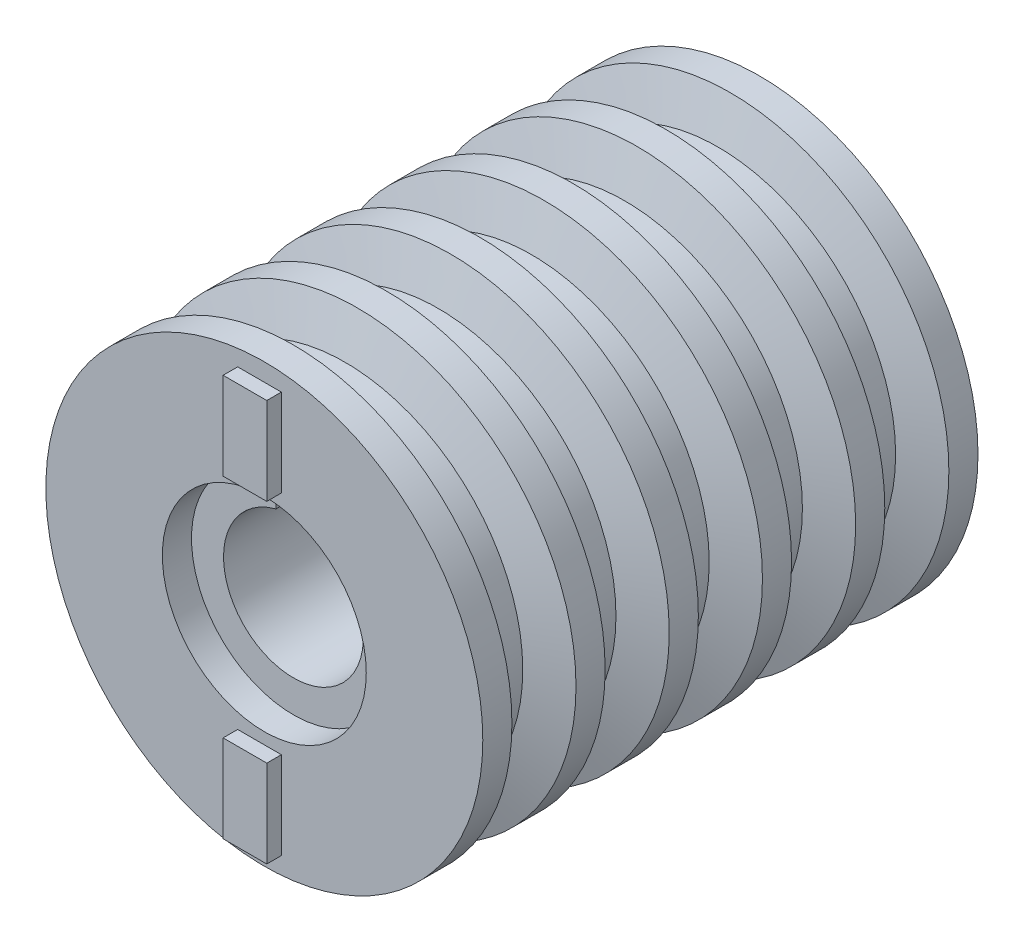
ISO-10303-21;
HEADER;
FILE_DESCRIPTION(('STEP AP214'),'2;1');
FILE_NAME('part.step','',(''),(''),'','','');
FILE_SCHEMA(('AUTOMOTIVE_DESIGN { 1 0 10303 214 1 1 1 1 }'));
ENDSEC;
DATA;
#1=APPLICATION_CONTEXT('core data for automotive mechanical design processes');
#2=APPLICATION_PROTOCOL_DEFINITION('international standard','automotive_design',2000,#1);
#3=PRODUCT_CONTEXT('',#1,'mechanical');
#4=PRODUCT('Part','Part','',(#3));
#5=PRODUCT_RELATED_PRODUCT_CATEGORY('part','',(#4));
#6=PRODUCT_DEFINITION_FORMATION('','',#4);
#7=PRODUCT_DEFINITION_CONTEXT('part definition',#1,'design');
#8=PRODUCT_DEFINITION('design','',#6,#7);
#9=PRODUCT_DEFINITION_SHAPE('','',#8);
#10=(LENGTH_UNIT() NAMED_UNIT(*) SI_UNIT(.MILLI.,.METRE.));
#11=(NAMED_UNIT(*) PLANE_ANGLE_UNIT() SI_UNIT($,.RADIAN.));
#12=(NAMED_UNIT(*) SI_UNIT($,.STERADIAN.) SOLID_ANGLE_UNIT());
#13=UNCERTAINTY_MEASURE_WITH_UNIT(LENGTH_MEASURE(1.E-05),#10,'distance_accuracy_value','');
#14=(GEOMETRIC_REPRESENTATION_CONTEXT(3) GLOBAL_UNCERTAINTY_ASSIGNED_CONTEXT((#13)) GLOBAL_UNIT_ASSIGNED_CONTEXT((#10,
#11,#12)) REPRESENTATION_CONTEXT('',''));
#15=CARTESIAN_POINT('',(0.,0.,0.));
#16=DIRECTION('',(0.,0.,1.));
#17=DIRECTION('',(1.,0.,0.));
#18=AXIS2_PLACEMENT_3D('',#15,#16,#17);
#19=CARTESIAN_POINT('',(0.,0.,85.));
#20=DIRECTION('',(0.,0.,1.));
#21=DIRECTION('',(1.,0.,0.));
#22=AXIS2_PLACEMENT_3D('',#19,#20,#21);
#23=PLANE('',#22);
#24=CARTESIAN_POINT('',(0.,0.,85.));
#25=DIRECTION('',(0.,0.,1.));
#26=DIRECTION('',(1.,0.,0.));
#27=AXIS2_PLACEMENT_3D('',#24,#25,#26);
#28=CIRCLE('',#27,35.);
#29=CARTESIAN_POINT('',(35.,0.,85.));
#30=VERTEX_POINT('',#29);
#31=EDGE_CURVE('E207',#30,#30,#28,.T.);
#32=ORIENTED_EDGE('',*,*,#31,.F.);
#33=EDGE_LOOP('',(#32));
#34=FACE_BOUND('',#33,.T.);
#35=CARTESIAN_POINT('',(0.,0.,85.));
#36=DIRECTION('',(0.,0.,1.));
#37=DIRECTION('',(1.,0.,0.));
#38=AXIS2_PLACEMENT_3D('',#35,#36,#37);
#39=CIRCLE('',#38,75.);
#40=CARTESIAN_POINT('',(75.,0.,85.));
#41=VERTEX_POINT('',#40);
#42=EDGE_CURVE('E287',#41,#41,#39,.T.);
#43=ORIENTED_EDGE('',*,*,#42,.T.);
#44=EDGE_LOOP('',(#43));
#45=FACE_BOUND('',#44,.T.);
#46=DIRECTION('',(0.,1.,0.));
#47=VECTOR('',#46,1.);
#48=CARTESIAN_POINT('',(5.85051895920107,-68.9005779312578,85.));
#49=LINE('',#48,#47);
#50=CARTESIAN_POINT('',(5.85051895920107,-68.9005779312578,85.));
#51=VERTEX_POINT('',#50);
#52=CARTESIAN_POINT('',(5.85051895920107,-38.9005779312578,85.));
#53=VERTEX_POINT('',#52);
#54=EDGE_CURVE('E186',#51,#53,#49,.T.);
#55=ORIENTED_EDGE('',*,*,#54,.F.);
#56=DIRECTION('',(1.,0.,0.));
#57=VECTOR('',#56,1.);
#58=CARTESIAN_POINT('',(-9.14948104079893,-68.9005779312578,85.));
#59=LINE('',#58,#57);
#60=CARTESIAN_POINT('',(-9.14948104079893,-68.9005779312578,85.));
#61=VERTEX_POINT('',#60);
#62=EDGE_CURVE('E188',#61,#51,#59,.T.);
#63=ORIENTED_EDGE('',*,*,#62,.F.);
#64=DIRECTION('',(0.,-1.,0.));
#65=VECTOR('',#64,1.);
#66=CARTESIAN_POINT('',(-9.14948104079893,-68.9005779312578,85.));
#67=LINE('',#66,#65);
#68=CARTESIAN_POINT('',(-9.14948104079893,-38.9005779312578,85.));
#69=VERTEX_POINT('',#68);
#70=EDGE_CURVE('E181',#69,#61,#67,.T.);
#71=ORIENTED_EDGE('',*,*,#70,.F.);
#72=DIRECTION('',(-1.,0.,0.));
#73=VECTOR('',#72,1.);
#74=CARTESIAN_POINT('',(-9.14948104079893,-38.9005779312578,85.));
#75=LINE('',#74,#73);
#76=EDGE_CURVE('E183',#53,#69,#75,.T.);
#77=ORIENTED_EDGE('',*,*,#76,.F.);
#78=EDGE_LOOP('',(#55,#63,#71,#77));
#79=FACE_BOUND('',#78,.T.);
#80=DIRECTION('',(1.,0.,0.));
#81=VECTOR('',#80,1.);
#82=CARTESIAN_POINT('',(-9.14948104079893,38.9005779312578,85.));
#83=LINE('',#82,#81);
#84=CARTESIAN_POINT('',(-9.14948104079893,38.9005779312578,85.));
#85=VERTEX_POINT('',#84);
#86=CARTESIAN_POINT('',(5.85051895920107,38.9005779312578,85.));
#87=VERTEX_POINT('',#86);
#88=EDGE_CURVE('E783',#85,#87,#83,.T.);
#89=ORIENTED_EDGE('',*,*,#88,.F.);
#90=DIRECTION('',(0.,-1.,0.));
#91=VECTOR('',#90,1.);
#92=CARTESIAN_POINT('',(-9.14948104079893,68.9005779312578,85.));
#93=LINE('',#92,#91);
#94=CARTESIAN_POINT('',(-9.14948104079893,68.9005779312578,85.));
#95=VERTEX_POINT('',#94);
#96=EDGE_CURVE('E161',#95,#85,#93,.T.);
#97=ORIENTED_EDGE('',*,*,#96,.F.);
#98=DIRECTION('',(-1.,0.,0.));
#99=VECTOR('',#98,1.);
#100=CARTESIAN_POINT('',(-9.14948104079893,68.9005779312578,85.));
#101=LINE('',#100,#99);
#102=CARTESIAN_POINT('',(5.85051895920107,68.9005779312578,85.));
#103=VERTEX_POINT('',#102);
#104=EDGE_CURVE('E157',#103,#95,#101,.T.);
#105=ORIENTED_EDGE('',*,*,#104,.F.);
#106=DIRECTION('',(0.,1.,0.));
#107=VECTOR('',#106,1.);
#108=CARTESIAN_POINT('',(5.85051895920107,68.9005779312578,85.));
#109=LINE('',#108,#107);
#110=EDGE_CURVE('E780',#87,#103,#109,.T.);
#111=ORIENTED_EDGE('',*,*,#110,.F.);
#112=EDGE_LOOP('',(#89,#97,#105,#111));
#113=FACE_BOUND('',#112,.T.);
#114=ADVANCED_FACE('F49',(#34,#45,#79,#113),#23,.T.);
#115=CARTESIAN_POINT('',(0.,0.,85.));
#116=DIRECTION('',(0.,0.,-1.));
#117=DIRECTION('',(-1.,0.,0.));
#118=AXIS2_PLACEMENT_3D('',#115,#116,#117);
#119=CYLINDRICAL_SURFACE('',#118,24.);
#120=DIRECTION('',(0.,0.,-1.));
#121=VECTOR('',#120,1.);
#122=CARTESIAN_POINT('',(6.,23.2379000772445,85.));
#123=LINE('',#122,#121);
#124=CARTESIAN_POINT('',(6.,23.2379000772445,-75.));
#125=VERTEX_POINT('',#124);
#126=CARTESIAN_POINT('',(6.,23.2379000772445,75.));
#127=VERTEX_POINT('',#126);
#128=EDGE_CURVE('E295',#125,#127,#123,.F.);
#129=ORIENTED_EDGE('',*,*,#128,.F.);
#130=CARTESIAN_POINT('',(0.,0.,-75.));
#131=DIRECTION('',(0.,0.,-1.));
#132=DIRECTION('',(-1.,0.,0.));
#133=AXIS2_PLACEMENT_3D('',#130,#131,#132);
#134=CIRCLE('',#133,24.);
#135=CARTESIAN_POINT('',(-6.,23.2379000772445,-75.));
#136=VERTEX_POINT('',#135);
#137=EDGE_CURVE('E204',#125,#136,#134,.T.);
#138=ORIENTED_EDGE('',*,*,#137,.T.);
#139=DIRECTION('',(0.,0.,-1.));
#140=VECTOR('',#139,1.);
#141=CARTESIAN_POINT('',(-6.,23.2379000772445,85.));
#142=LINE('',#141,#140);
#143=CARTESIAN_POINT('',(-6.,23.2379000772445,75.));
#144=VERTEX_POINT('',#143);
#145=EDGE_CURVE('E290',#144,#136,#142,.T.);
#146=ORIENTED_EDGE('',*,*,#145,.F.);
#147=CARTESIAN_POINT('',(0.,0.,75.));
#148=DIRECTION('',(0.,0.,1.));
#149=DIRECTION('',(1.,0.,0.));
#150=AXIS2_PLACEMENT_3D('',#147,#148,#149);
#151=CIRCLE('',#150,24.);
#152=EDGE_CURVE('E219',#144,#127,#151,.T.);
#153=ORIENTED_EDGE('',*,*,#152,.T.);
#154=EDGE_LOOP('',(#129,#138,#146,#153));
#155=FACE_BOUND('',#154,.T.);
#156=ADVANCED_FACE('F311',(#155),#119,.F.);
#157=CARTESIAN_POINT('',(6.,21.,-85.));
#158=DIRECTION('',(1.,0.,0.));
#159=DIRECTION('',(0.,0.,-1.));
#160=AXIS2_PLACEMENT_3D('',#157,#158,#159);
#161=PLANE('',#160);
#162=DIRECTION('',(0.,1.,0.));
#163=VECTOR('',#162,1.);
#164=CARTESIAN_POINT('',(6.,21.,-75.));
#165=LINE('',#164,#163);
#166=CARTESIAN_POINT('',(6.,27.,-75.));
#167=VERTEX_POINT('',#166);
#168=EDGE_CURVE('E202',#125,#167,#165,.T.);
#169=ORIENTED_EDGE('',*,*,#168,.F.);
#170=ORIENTED_EDGE('',*,*,#128,.T.);
#171=DIRECTION('',(0.,-1.,0.));
#172=VECTOR('',#171,1.);
#173=CARTESIAN_POINT('',(6.,21.,75.));
#174=LINE('',#173,#172);
#175=CARTESIAN_POINT('',(6.,27.,75.));
#176=VERTEX_POINT('',#175);
#177=EDGE_CURVE('E216',#176,#127,#174,.T.);
#178=ORIENTED_EDGE('',*,*,#177,.F.);
#179=DIRECTION('',(0.,0.,1.));
#180=VECTOR('',#179,1.);
#181=CARTESIAN_POINT('',(6.,27.,-85.));
#182=LINE('',#181,#180);
#183=EDGE_CURVE('E222',#167,#176,#182,.T.);
#184=ORIENTED_EDGE('',*,*,#183,.F.);
#185=EDGE_LOOP('',(#169,#170,#178,#184));
#186=FACE_BOUND('',#185,.T.);
#187=ADVANCED_FACE('F308',(#186),#161,.F.);
#188=CARTESIAN_POINT('',(-6.,21.,-85.));
#189=DIRECTION('',(-1.,0.,0.));
#190=DIRECTION('',(0.,0.,1.));
#191=AXIS2_PLACEMENT_3D('',#188,#189,#190);
#192=PLANE('',#191);
#193=DIRECTION('',(0.,-1.,0.));
#194=VECTOR('',#193,1.);
#195=CARTESIAN_POINT('',(-6.,21.,-75.));
#196=LINE('',#195,#194);
#197=CARTESIAN_POINT('',(-6.,27.,-75.));
#198=VERTEX_POINT('',#197);
#199=EDGE_CURVE('E199',#198,#136,#196,.T.);
#200=ORIENTED_EDGE('',*,*,#199,.F.);
#201=DIRECTION('',(0.,0.,1.));
#202=VECTOR('',#201,1.);
#203=CARTESIAN_POINT('',(-6.,27.,-85.));
#204=LINE('',#203,#202);
#205=CARTESIAN_POINT('',(-6.,27.,75.));
#206=VERTEX_POINT('',#205);
#207=EDGE_CURVE('E223',#198,#206,#204,.T.);
#208=ORIENTED_EDGE('',*,*,#207,.T.);
#209=DIRECTION('',(0.,1.,0.));
#210=VECTOR('',#209,1.);
#211=CARTESIAN_POINT('',(-6.,21.,75.));
#212=LINE('',#211,#210);
#213=EDGE_CURVE('E211',#144,#206,#212,.T.);
#214=ORIENTED_EDGE('',*,*,#213,.F.);
#215=ORIENTED_EDGE('',*,*,#145,.T.);
#216=EDGE_LOOP('',(#200,#208,#214,#215));
#217=FACE_BOUND('',#216,.T.);
#218=ADVANCED_FACE('F315',(#217),#192,.F.);
#219=CARTESIAN_POINT('',(-6.,27.,-85.));
#220=DIRECTION('',(0.,1.,0.));
#221=DIRECTION('',(0.,0.,1.));
#222=AXIS2_PLACEMENT_3D('',#219,#220,#221);
#223=PLANE('',#222);
#224=DIRECTION('',(-1.,0.,0.));
#225=VECTOR('',#224,1.);
#226=CARTESIAN_POINT('',(-6.,27.,-75.));
#227=LINE('',#226,#225);
#228=EDGE_CURVE('E11',#167,#198,#227,.T.);
#229=ORIENTED_EDGE('',*,*,#228,.F.);
#230=ORIENTED_EDGE('',*,*,#183,.T.);
#231=DIRECTION('',(1.,0.,0.));
#232=VECTOR('',#231,1.);
#233=CARTESIAN_POINT('',(-6.,27.,75.));
#234=LINE('',#233,#232);
#235=EDGE_CURVE('E57',#206,#176,#234,.T.);
#236=ORIENTED_EDGE('',*,*,#235,.F.);
#237=ORIENTED_EDGE('',*,*,#207,.F.);
#238=EDGE_LOOP('',(#229,#230,#236,#237));
#239=FACE_BOUND('',#238,.T.);
#240=ADVANCED_FACE('F317',(#239),#223,.F.);
#241=CARTESIAN_POINT('',(0.,0.,85.));
#242=DIRECTION('',(0.,0.,-1.));
#243=DIRECTION('',(-1.,0.,0.));
#244=AXIS2_PLACEMENT_3D('',#241,#242,#243);
#245=CYLINDRICAL_SURFACE('',#244,75.);
#246=CARTESIAN_POINT('',(0.,0.,-75.));
#247=DIRECTION('',(0.,0.,1.));
#248=DIRECTION('',(1.,0.,0.));
#249=AXIS2_PLACEMENT_3D('',#246,#247,#248);
#250=CIRCLE('',#249,75.);
#251=CARTESIAN_POINT('',(75.,0.,-75.));
#252=VERTEX_POINT('',#251);
#253=EDGE_CURVE('E237',#252,#252,#250,.T.);
#254=ORIENTED_EDGE('',*,*,#253,.F.);
#255=EDGE_LOOP('',(#254));
#256=FACE_BOUND('',#255,.T.);
#257=CARTESIAN_POINT('',(0.,0.,-85.));
#258=DIRECTION('',(0.,0.,1.));
#259=DIRECTION('',(1.,0.,0.));
#260=AXIS2_PLACEMENT_3D('',#257,#258,#259);
#261=CIRCLE('',#260,75.);
#262=CARTESIAN_POINT('',(75.,0.,-85.));
#263=VERTEX_POINT('',#262);
#264=EDGE_CURVE('E240',#263,#263,#261,.T.);
#265=ORIENTED_EDGE('',*,*,#264,.T.);
#266=EDGE_LOOP('',(#265));
#267=FACE_BOUND('',#266,.T.);
#268=ADVANCED_FACE('F339',(#256,#267),#245,.T.);
#269=CARTESIAN_POINT('',(0.,0.,75.));
#270=DIRECTION('',(0.,0.,1.));
#271=DIRECTION('',(1.,0.,0.));
#272=AXIS2_PLACEMENT_3D('',#269,#270,#271);
#273=CIRCLE('',#272,75.);
#274=CARTESIAN_POINT('',(75.,0.,75.));
#275=VERTEX_POINT('',#274);
#276=EDGE_CURVE('E245',#275,#275,#273,.T.);
#277=ORIENTED_EDGE('',*,*,#276,.T.);
#278=EDGE_LOOP('',(#277));
#279=FACE_BOUND('',#278,.T.);
#280=ORIENTED_EDGE('',*,*,#42,.F.);
#281=EDGE_LOOP('',(#280));
#282=FACE_BOUND('',#281,.T.);
#283=ADVANCED_FACE('F336',(#279,#282),#245,.T.);
#284=CARTESIAN_POINT('',(0.,0.,-85.));
#285=DIRECTION('',(0.,0.,1.));
#286=DIRECTION('',(1.,0.,0.));
#287=AXIS2_PLACEMENT_3D('',#284,#285,#286);
#288=PLANE('',#287);
#289=CARTESIAN_POINT('',(0.,0.,-85.));
#290=DIRECTION('',(0.,0.,1.));
#291=DIRECTION('',(1.,0.,0.));
#292=AXIS2_PLACEMENT_3D('',#289,#290,#291);
#293=CIRCLE('',#292,35.);
#294=CARTESIAN_POINT('',(35.,0.,-85.));
#295=VERTEX_POINT('',#294);
#296=EDGE_CURVE('E163',#295,#295,#293,.T.);
#297=ORIENTED_EDGE('',*,*,#296,.T.);
#298=EDGE_LOOP('',(#297));
#299=FACE_BOUND('',#298,.T.);
#300=ORIENTED_EDGE('',*,*,#264,.F.);
#301=EDGE_LOOP('',(#300));
#302=FACE_BOUND('',#301,.T.);
#303=ADVANCED_FACE('F332',(#299,#302),#288,.F.);
#304=CARTESIAN_POINT('',(0.,0.,70.7197704595787));
#305=DIRECTION('',(0.,0.,1.));
#306=DIRECTION('',(1.,0.,0.));
#307=AXIS2_PLACEMENT_3D('',#304,#305,#306);
#308=CONICAL_SURFACE('',#307,61.,1.27409035395586);
#309=ORIENTED_EDGE('',*,*,#276,.F.);
#310=EDGE_LOOP('',(#309));
#311=FACE_BOUND('',#310,.T.);
#312=CARTESIAN_POINT('',(0.,0.,70.7197704595787));
#313=DIRECTION('',(0.,0.,1.));
#314=DIRECTION('',(1.,0.,0.));
#315=AXIS2_PLACEMENT_3D('',#312,#313,#314);
#316=CIRCLE('',#315,61.);
#317=CARTESIAN_POINT('',(61.,0.,70.7197704595787));
#318=VERTEX_POINT('',#317);
#319=EDGE_CURVE('E225',#318,#318,#316,.T.);
#320=ORIENTED_EDGE('',*,*,#319,.T.);
#321=EDGE_LOOP('',(#320));
#322=FACE_BOUND('',#321,.T.);
#323=ADVANCED_FACE('F335',(#311,#322),#308,.T.);
#324=CARTESIAN_POINT('',(0.,0.,53.));
#325=DIRECTION('',(0.,0.,-1.));
#326=DIRECTION('',(-1.,0.,0.));
#327=AXIS2_PLACEMENT_3D('',#324,#325,#326);
#328=CONICAL_SURFACE('',#327,75.,1.27409035395586);
#329=CARTESIAN_POINT('',(0.,0.,57.2802295404213));
#330=DIRECTION('',(0.,0.,1.));
#331=DIRECTION('',(1.,0.,0.));
#332=AXIS2_PLACEMENT_3D('',#329,#330,#331);
#333=CIRCLE('',#332,61.);
#334=CARTESIAN_POINT('',(61.,0.,57.2802295404213));
#335=VERTEX_POINT('',#334);
#336=EDGE_CURVE('E257',#335,#335,#333,.T.);
#337=ORIENTED_EDGE('',*,*,#336,.F.);
#338=EDGE_LOOP('',(#337));
#339=FACE_BOUND('',#338,.T.);
#340=CARTESIAN_POINT('',(0.,0.,53.));
#341=DIRECTION('',(0.,0.,1.));
#342=DIRECTION('',(1.,0.,0.));
#343=AXIS2_PLACEMENT_3D('',#340,#341,#342);
#344=CIRCLE('',#343,75.);
#345=CARTESIAN_POINT('',(75.,0.,53.));
#346=VERTEX_POINT('',#345);
#347=EDGE_CURVE('E260',#346,#346,#344,.T.);
#348=ORIENTED_EDGE('',*,*,#347,.T.);
#349=EDGE_LOOP('',(#348));
#350=FACE_BOUND('',#349,.T.);
#351=ADVANCED_FACE('F392',(#339,#350),#328,.T.);
#352=CARTESIAN_POINT('',(0.,0.,0.));
#353=DIRECTION('',(0.,0.,1.));
#354=DIRECTION('',(1.,0.,0.));
#355=AXIS2_PLACEMENT_3D('',#352,#353,#354);
#356=CYLINDRICAL_SURFACE('',#355,61.);
#357=ORIENTED_EDGE('',*,*,#319,.F.);
#358=EDGE_LOOP('',(#357));
#359=FACE_BOUND('',#358,.T.);
#360=ORIENTED_EDGE('',*,*,#336,.T.);
#361=EDGE_LOOP('',(#360));
#362=FACE_BOUND('',#361,.T.);
#363=ADVANCED_FACE('F396',(#359,#362),#356,.T.);
#364=CARTESIAN_POINT('',(0.,0.,-75.));
#365=DIRECTION('',(0.,0.,-1.));
#366=DIRECTION('',(-1.,0.,0.));
#367=AXIS2_PLACEMENT_3D('',#364,#365,#366);
#368=CONICAL_SURFACE('',#367,75.,1.27409035395586);
#369=CARTESIAN_POINT('',(0.,0.,-70.7197704595787));
#370=DIRECTION('',(0.,0.,1.));
#371=DIRECTION('',(1.,0.,0.));
#372=AXIS2_PLACEMENT_3D('',#369,#370,#371);
#373=CIRCLE('',#372,61.);
#374=CARTESIAN_POINT('',(61.,0.,-70.7197704595787));
#375=VERTEX_POINT('',#374);
#376=EDGE_CURVE('E234',#375,#375,#373,.T.);
#377=ORIENTED_EDGE('',*,*,#376,.F.);
#378=EDGE_LOOP('',(#377));
#379=FACE_BOUND('',#378,.T.);
#380=ORIENTED_EDGE('',*,*,#253,.T.);
#381=EDGE_LOOP('',(#380));
#382=FACE_BOUND('',#381,.T.);
#383=ADVANCED_FACE('F400',(#379,#382),#368,.T.);
#384=CARTESIAN_POINT('',(0.,0.,0.));
#385=DIRECTION('',(0.,0.,1.));
#386=DIRECTION('',(1.,0.,0.));
#387=AXIS2_PLACEMENT_3D('',#384,#385,#386);
#388=CYLINDRICAL_SURFACE('',#387,61.);
#389=CARTESIAN_POINT('',(0.,0.,-57.2802295404213));
#390=DIRECTION('',(0.,0.,1.));
#391=DIRECTION('',(1.,0.,0.));
#392=AXIS2_PLACEMENT_3D('',#389,#390,#391);
#393=CIRCLE('',#392,61.);
#394=CARTESIAN_POINT('',(61.,0.,-57.2802295404213));
#395=VERTEX_POINT('',#394);
#396=EDGE_CURVE('E230',#395,#395,#393,.T.);
#397=ORIENTED_EDGE('',*,*,#396,.F.);
#398=EDGE_LOOP('',(#397));
#399=FACE_BOUND('',#398,.T.);
#400=ORIENTED_EDGE('',*,*,#376,.T.);
#401=EDGE_LOOP('',(#400));
#402=FACE_BOUND('',#401,.T.);
#403=ADVANCED_FACE('F416',(#399,#402),#388,.T.);
#404=CARTESIAN_POINT('',(0.,0.,-57.2802295404213));
#405=DIRECTION('',(0.,0.,1.));
#406=DIRECTION('',(1.,0.,0.));
#407=AXIS2_PLACEMENT_3D('',#404,#405,#406);
#408=CONICAL_SURFACE('',#407,61.,1.27409035395586);
#409=CARTESIAN_POINT('',(0.,0.,-53.));
#410=DIRECTION('',(0.,0.,1.));
#411=DIRECTION('',(1.,0.,0.));
#412=AXIS2_PLACEMENT_3D('',#409,#410,#411);
#413=CIRCLE('',#412,75.);
#414=CARTESIAN_POINT('',(75.,0.,-53.));
#415=VERTEX_POINT('',#414);
#416=EDGE_CURVE('E227',#415,#415,#413,.T.);
#417=ORIENTED_EDGE('',*,*,#416,.F.);
#418=EDGE_LOOP('',(#417));
#419=FACE_BOUND('',#418,.T.);
#420=ORIENTED_EDGE('',*,*,#396,.T.);
#421=EDGE_LOOP('',(#420));
#422=FACE_BOUND('',#421,.T.);
#423=ADVANCED_FACE('F420',(#419,#422),#408,.T.);
#424=ORIENTED_EDGE('',*,*,#416,.T.);
#425=EDGE_LOOP('',(#424));
#426=FACE_BOUND('',#425,.T.);
#427=CARTESIAN_POINT('',(0.,0.,-43.));
#428=DIRECTION('',(0.,0.,1.));
#429=DIRECTION('',(1.,0.,0.));
#430=AXIS2_PLACEMENT_3D('',#427,#428,#429);
#431=CIRCLE('',#430,75.);
#432=CARTESIAN_POINT('',(75.,0.,-43.));
#433=VERTEX_POINT('',#432);
#434=EDGE_CURVE('E231',#433,#433,#431,.T.);
#435=ORIENTED_EDGE('',*,*,#434,.F.);
#436=EDGE_LOOP('',(#435));
#437=FACE_BOUND('',#436,.T.);
#438=ADVANCED_FACE('F352',(#426,#437),#245,.T.);
#439=ORIENTED_EDGE('',*,*,#347,.F.);
#440=EDGE_LOOP('',(#439));
#441=FACE_BOUND('',#440,.T.);
#442=CARTESIAN_POINT('',(0.,0.,43.));
#443=DIRECTION('',(0.,0.,1.));
#444=DIRECTION('',(1.,0.,0.));
#445=AXIS2_PLACEMENT_3D('',#442,#443,#444);
#446=CIRCLE('',#445,75.);
#447=CARTESIAN_POINT('',(75.,0.,43.));
#448=VERTEX_POINT('',#447);
#449=EDGE_CURVE('E282',#448,#448,#446,.T.);
#450=ORIENTED_EDGE('',*,*,#449,.T.);
#451=EDGE_LOOP('',(#450));
#452=FACE_BOUND('',#451,.T.);
#453=ADVANCED_FACE('F51',(#441,#452),#245,.T.);
#454=CARTESIAN_POINT('',(0.,0.,21.));
#455=DIRECTION('',(0.,0.,-1.));
#456=DIRECTION('',(-1.,0.,0.));
#457=AXIS2_PLACEMENT_3D('',#454,#455,#456);
#458=CONICAL_SURFACE('',#457,75.,1.27409035395586);
#459=CARTESIAN_POINT('',(0.,0.,25.2802295404213));
#460=DIRECTION('',(0.,0.,1.));
#461=DIRECTION('',(1.,0.,0.));
#462=AXIS2_PLACEMENT_3D('',#459,#460,#461);
#463=CIRCLE('',#462,61.);
#464=CARTESIAN_POINT('',(61.,0.,25.2802295404213));
#465=VERTEX_POINT('',#464);
#466=EDGE_CURVE('E254',#465,#465,#463,.T.);
#467=ORIENTED_EDGE('',*,*,#466,.F.);
#468=EDGE_LOOP('',(#467));
#469=FACE_BOUND('',#468,.T.);
#470=CARTESIAN_POINT('',(0.,0.,21.));
#471=DIRECTION('',(0.,0.,1.));
#472=DIRECTION('',(1.,0.,0.));
#473=AXIS2_PLACEMENT_3D('',#470,#471,#472);
#474=CIRCLE('',#473,75.);
#475=CARTESIAN_POINT('',(75.,0.,21.));
#476=VERTEX_POINT('',#475);
#477=EDGE_CURVE('E269',#476,#476,#474,.T.);
#478=ORIENTED_EDGE('',*,*,#477,.T.);
#479=EDGE_LOOP('',(#478));
#480=FACE_BOUND('',#479,.T.);
#481=ADVANCED_FACE('F351',(#469,#480),#458,.T.);
#482=CARTESIAN_POINT('',(0.,0.,38.7197704595787));
#483=DIRECTION('',(0.,0.,1.));
#484=DIRECTION('',(1.,0.,0.));
#485=AXIS2_PLACEMENT_3D('',#482,#483,#484);
#486=CONICAL_SURFACE('',#485,61.,1.27409035395586);
#487=ORIENTED_EDGE('',*,*,#449,.F.);
#488=EDGE_LOOP('',(#487));
#489=FACE_BOUND('',#488,.T.);
#490=CARTESIAN_POINT('',(0.,0.,38.7197704595787));
#491=DIRECTION('',(0.,0.,1.));
#492=DIRECTION('',(1.,0.,0.));
#493=AXIS2_PLACEMENT_3D('',#490,#491,#492);
#494=CIRCLE('',#493,61.);
#495=CARTESIAN_POINT('',(61.,0.,38.7197704595787));
#496=VERTEX_POINT('',#495);
#497=EDGE_CURVE('E279',#496,#496,#494,.T.);
#498=ORIENTED_EDGE('',*,*,#497,.T.);
#499=EDGE_LOOP('',(#498));
#500=FACE_BOUND('',#499,.T.);
#501=ADVANCED_FACE('F367',(#489,#500),#486,.T.);
#502=CARTESIAN_POINT('',(0.,0.,0.));
#503=DIRECTION('',(0.,0.,1.));
#504=DIRECTION('',(1.,0.,0.));
#505=AXIS2_PLACEMENT_3D('',#502,#503,#504);
#506=CYLINDRICAL_SURFACE('',#505,61.);
#507=ORIENTED_EDGE('',*,*,#497,.F.);
#508=EDGE_LOOP('',(#507));
#509=FACE_BOUND('',#508,.T.);
#510=ORIENTED_EDGE('',*,*,#466,.T.);
#511=EDGE_LOOP('',(#510));
#512=FACE_BOUND('',#511,.T.);
#513=ADVANCED_FACE('F371',(#509,#512),#506,.T.);
#514=CARTESIAN_POINT('',(0.,0.,11.));
#515=DIRECTION('',(0.,0.,1.));
#516=DIRECTION('',(1.,0.,0.));
#517=AXIS2_PLACEMENT_3D('',#514,#515,#516);
#518=CIRCLE('',#517,75.);
#519=CARTESIAN_POINT('',(75.,0.,11.));
#520=VERTEX_POINT('',#519);
#521=EDGE_CURVE('E241',#520,#520,#518,.T.);
#522=ORIENTED_EDGE('',*,*,#521,.T.);
#523=EDGE_LOOP('',(#522));
#524=FACE_BOUND('',#523,.T.);
#525=ORIENTED_EDGE('',*,*,#477,.F.);
#526=EDGE_LOOP('',(#525));
#527=FACE_BOUND('',#526,.T.);
#528=ADVANCED_FACE('F375',(#524,#527),#245,.T.);
#529=CARTESIAN_POINT('',(0.,0.,-11.));
#530=DIRECTION('',(0.,0.,-1.));
#531=DIRECTION('',(-1.,0.,0.));
#532=AXIS2_PLACEMENT_3D('',#529,#530,#531);
#533=CONICAL_SURFACE('',#532,75.,1.27409035395586);
#534=CARTESIAN_POINT('',(0.,0.,-6.7197704595787));
#535=DIRECTION('',(0.,0.,1.));
#536=DIRECTION('',(1.,0.,0.));
#537=AXIS2_PLACEMENT_3D('',#534,#535,#536);
#538=CIRCLE('',#537,61.);
#539=CARTESIAN_POINT('',(61.,0.,-6.7197704595787));
#540=VERTEX_POINT('',#539);
#541=EDGE_CURVE('E248',#540,#540,#538,.T.);
#542=ORIENTED_EDGE('',*,*,#541,.F.);
#543=EDGE_LOOP('',(#542));
#544=FACE_BOUND('',#543,.T.);
#545=CARTESIAN_POINT('',(0.,0.,-11.));
#546=DIRECTION('',(0.,0.,1.));
#547=DIRECTION('',(1.,0.,0.));
#548=AXIS2_PLACEMENT_3D('',#545,#546,#547);
#549=CIRCLE('',#548,75.);
#550=CARTESIAN_POINT('',(75.,0.,-11.));
#551=VERTEX_POINT('',#550);
#552=EDGE_CURVE('E251',#551,#551,#549,.T.);
#553=ORIENTED_EDGE('',*,*,#552,.T.);
#554=EDGE_LOOP('',(#553));
#555=FACE_BOUND('',#554,.T.);
#556=ADVANCED_FACE('F402',(#544,#555),#533,.T.);
#557=CARTESIAN_POINT('',(0.,0.,0.));
#558=DIRECTION('',(0.,0.,1.));
#559=DIRECTION('',(1.,0.,0.));
#560=AXIS2_PLACEMENT_3D('',#557,#558,#559);
#561=CYLINDRICAL_SURFACE('',#560,61.);
#562=CARTESIAN_POINT('',(0.,0.,6.71977045957869));
#563=DIRECTION('',(0.,0.,1.));
#564=DIRECTION('',(1.,0.,0.));
#565=AXIS2_PLACEMENT_3D('',#562,#563,#564);
#566=CIRCLE('',#565,61.);
#567=CARTESIAN_POINT('',(61.,0.,6.71977045957869));
#568=VERTEX_POINT('',#567);
#569=EDGE_CURVE('E244',#568,#568,#566,.T.);
#570=ORIENTED_EDGE('',*,*,#569,.F.);
#571=EDGE_LOOP('',(#570));
#572=FACE_BOUND('',#571,.T.);
#573=ORIENTED_EDGE('',*,*,#541,.T.);
#574=EDGE_LOOP('',(#573));
#575=FACE_BOUND('',#574,.T.);
#576=ADVANCED_FACE('F405',(#572,#575),#561,.T.);
#577=CARTESIAN_POINT('',(0.,0.,6.71977045957869));
#578=DIRECTION('',(0.,0.,1.));
#579=DIRECTION('',(1.,0.,0.));
#580=AXIS2_PLACEMENT_3D('',#577,#578,#579);
#581=CONICAL_SURFACE('',#580,61.,1.27409035395586);
#582=ORIENTED_EDGE('',*,*,#521,.F.);
#583=EDGE_LOOP('',(#582));
#584=FACE_BOUND('',#583,.T.);
#585=ORIENTED_EDGE('',*,*,#569,.T.);
#586=EDGE_LOOP('',(#585));
#587=FACE_BOUND('',#586,.T.);
#588=ADVANCED_FACE('F409',(#584,#587),#581,.T.);
#589=ORIENTED_EDGE('',*,*,#552,.F.);
#590=EDGE_LOOP('',(#589));
#591=FACE_BOUND('',#590,.T.);
#592=CARTESIAN_POINT('',(0.,0.,-21.));
#593=DIRECTION('',(0.,0.,1.));
#594=DIRECTION('',(1.,0.,0.));
#595=AXIS2_PLACEMENT_3D('',#592,#593,#594);
#596=CIRCLE('',#595,75.);
#597=CARTESIAN_POINT('',(75.,0.,-21.));
#598=VERTEX_POINT('',#597);
#599=EDGE_CURVE('E272',#598,#598,#596,.T.);
#600=ORIENTED_EDGE('',*,*,#599,.T.);
#601=EDGE_LOOP('',(#600));
#602=FACE_BOUND('',#601,.T.);
#603=ADVANCED_FACE('F346',(#591,#602),#245,.T.);
#604=CARTESIAN_POINT('',(0.,0.,-43.));
#605=DIRECTION('',(0.,0.,-1.));
#606=DIRECTION('',(-1.,0.,0.));
#607=AXIS2_PLACEMENT_3D('',#604,#605,#606);
#608=CONICAL_SURFACE('',#607,75.,1.27409035395586);
#609=CARTESIAN_POINT('',(0.,0.,-38.7197704595787));
#610=DIRECTION('',(0.,0.,1.));
#611=DIRECTION('',(1.,0.,0.));
#612=AXIS2_PLACEMENT_3D('',#609,#610,#611);
#613=CIRCLE('',#612,61.);
#614=CARTESIAN_POINT('',(61.,0.,-38.7197704595787));
#615=VERTEX_POINT('',#614);
#616=EDGE_CURVE('E265',#615,#615,#613,.T.);
#617=ORIENTED_EDGE('',*,*,#616,.F.);
#618=EDGE_LOOP('',(#617));
#619=FACE_BOUND('',#618,.T.);
#620=ORIENTED_EDGE('',*,*,#434,.T.);
#621=EDGE_LOOP('',(#620));
#622=FACE_BOUND('',#621,.T.);
#623=ADVANCED_FACE('F377',(#619,#622),#608,.T.);
#624=CARTESIAN_POINT('',(0.,0.,-25.2802295404213));
#625=DIRECTION('',(0.,0.,1.));
#626=DIRECTION('',(1.,0.,0.));
#627=AXIS2_PLACEMENT_3D('',#624,#625,#626);
#628=CONICAL_SURFACE('',#627,61.,1.27409035395586);
#629=ORIENTED_EDGE('',*,*,#599,.F.);
#630=EDGE_LOOP('',(#629));
#631=FACE_BOUND('',#630,.T.);
#632=CARTESIAN_POINT('',(0.,0.,-25.2802295404213));
#633=DIRECTION('',(0.,0.,1.));
#634=DIRECTION('',(1.,0.,0.));
#635=AXIS2_PLACEMENT_3D('',#632,#633,#634);
#636=CIRCLE('',#635,61.);
#637=CARTESIAN_POINT('',(61.,0.,-25.2802295404213));
#638=VERTEX_POINT('',#637);
#639=EDGE_CURVE('E268',#638,#638,#636,.T.);
#640=ORIENTED_EDGE('',*,*,#639,.T.);
#641=EDGE_LOOP('',(#640));
#642=FACE_BOUND('',#641,.T.);
#643=ADVANCED_FACE('F380',(#631,#642),#628,.T.);
#644=CARTESIAN_POINT('',(0.,0.,0.));
#645=DIRECTION('',(0.,0.,1.));
#646=DIRECTION('',(1.,0.,0.));
#647=AXIS2_PLACEMENT_3D('',#644,#645,#646);
#648=CYLINDRICAL_SURFACE('',#647,61.);
#649=ORIENTED_EDGE('',*,*,#639,.F.);
#650=EDGE_LOOP('',(#649));
#651=FACE_BOUND('',#650,.T.);
#652=ORIENTED_EDGE('',*,*,#616,.T.);
#653=EDGE_LOOP('',(#652));
#654=FACE_BOUND('',#653,.T.);
#655=ADVANCED_FACE('F384',(#651,#654),#648,.T.);
#656=CARTESIAN_POINT('',(0.,0.,75.));
#657=DIRECTION('',(0.,0.,1.));
#658=DIRECTION('',(1.,0.,0.));
#659=AXIS2_PLACEMENT_3D('',#656,#657,#658);
#660=CYLINDRICAL_SURFACE('',#659,35.);
#661=CARTESIAN_POINT('',(0.,0.,75.));
#662=DIRECTION('',(0.,0.,1.));
#663=DIRECTION('',(1.,0.,0.));
#664=AXIS2_PLACEMENT_3D('',#661,#662,#663);
#665=CIRCLE('',#664,35.);
#666=CARTESIAN_POINT('',(35.,0.,75.));
#667=VERTEX_POINT('',#666);
#668=EDGE_CURVE('E208',#667,#667,#665,.T.);
#669=ORIENTED_EDGE('',*,*,#668,.F.);
#670=EDGE_LOOP('',(#669));
#671=FACE_BOUND('',#670,.T.);
#672=ORIENTED_EDGE('',*,*,#31,.T.);
#673=EDGE_LOOP('',(#672));
#674=FACE_BOUND('',#673,.T.);
#675=ADVANCED_FACE('F388',(#671,#674),#660,.F.);
#676=CARTESIAN_POINT('',(0.,0.,75.));
#677=DIRECTION('',(0.,0.,1.));
#678=DIRECTION('',(1.,0.,0.));
#679=AXIS2_PLACEMENT_3D('',#676,#677,#678);
#680=PLANE('',#679);
#681=ORIENTED_EDGE('',*,*,#213,.T.);
#682=ORIENTED_EDGE('',*,*,#235,.T.);
#683=ORIENTED_EDGE('',*,*,#177,.T.);
#684=ORIENTED_EDGE('',*,*,#152,.F.);
#685=EDGE_LOOP('',(#681,#682,#683,#684));
#686=FACE_BOUND('',#685,.T.);
#687=ORIENTED_EDGE('',*,*,#668,.T.);
#688=EDGE_LOOP('',(#687));
#689=FACE_BOUND('',#688,.T.);
#690=ADVANCED_FACE('F300',(#686,#689),#680,.T.);
#691=CARTESIAN_POINT('',(0.,0.,-75.));
#692=DIRECTION('',(0.,0.,-1.));
#693=DIRECTION('',(1.,0.,0.));
#694=AXIS2_PLACEMENT_3D('',#691,#692,#693);
#695=PLANE('',#694);
#696=ORIENTED_EDGE('',*,*,#168,.T.);
#697=ORIENTED_EDGE('',*,*,#228,.T.);
#698=ORIENTED_EDGE('',*,*,#199,.T.);
#699=ORIENTED_EDGE('',*,*,#137,.F.);
#700=EDGE_LOOP('',(#696,#697,#698,#699));
#701=FACE_BOUND('',#700,.T.);
#702=CARTESIAN_POINT('',(0.,0.,-75.));
#703=DIRECTION('',(0.,0.,1.));
#704=DIRECTION('',(1.,0.,0.));
#705=AXIS2_PLACEMENT_3D('',#702,#703,#704);
#706=CIRCLE('',#705,35.);
#707=CARTESIAN_POINT('',(35.,0.,-75.));
#708=VERTEX_POINT('',#707);
#709=EDGE_CURVE('E166',#708,#708,#706,.T.);
#710=ORIENTED_EDGE('',*,*,#709,.F.);
#711=EDGE_LOOP('',(#710));
#712=FACE_BOUND('',#711,.T.);
#713=ADVANCED_FACE('F319',(#701,#712),#695,.T.);
#714=CARTESIAN_POINT('',(0.,0.,-75.));
#715=DIRECTION('',(0.,0.,-1.));
#716=DIRECTION('',(-1.,0.,0.));
#717=AXIS2_PLACEMENT_3D('',#714,#715,#716);
#718=CYLINDRICAL_SURFACE('',#717,35.);
#719=ORIENTED_EDGE('',*,*,#709,.T.);
#720=EDGE_LOOP('',(#719));
#721=FACE_BOUND('',#720,.T.);
#722=ORIENTED_EDGE('',*,*,#296,.F.);
#723=EDGE_LOOP('',(#722));
#724=FACE_BOUND('',#723,.T.);
#725=ADVANCED_FACE('F322',(#721,#724),#718,.F.);
#726=CARTESIAN_POINT('',(-9.14948104079893,-68.9005779312578,90.));
#727=DIRECTION('',(0.,1.,0.));
#728=DIRECTION('',(0.,0.,1.));
#729=AXIS2_PLACEMENT_3D('',#726,#727,#728);
#730=PLANE('',#729);
#731=ORIENTED_EDGE('',*,*,#62,.T.);
#732=DIRECTION('',(0.,0.,-1.));
#733=VECTOR('',#732,1.);
#734=CARTESIAN_POINT('',(5.85051895920107,-68.9005779312578,90.));
#735=LINE('',#734,#733);
#736=CARTESIAN_POINT('',(5.85051895920107,-68.9005779312578,90.));
#737=VERTEX_POINT('',#736);
#738=EDGE_CURVE('E171',#737,#51,#735,.T.);
#739=ORIENTED_EDGE('',*,*,#738,.F.);
#740=DIRECTION('',(1.,0.,0.));
#741=VECTOR('',#740,1.);
#742=CARTESIAN_POINT('',(-9.14948104079893,-68.9005779312578,90.));
#743=LINE('',#742,#741);
#744=CARTESIAN_POINT('',(-9.14948104079893,-68.9005779312578,90.));
#745=VERTEX_POINT('',#744);
#746=EDGE_CURVE('E184',#745,#737,#743,.T.);
#747=ORIENTED_EDGE('',*,*,#746,.F.);
#748=DIRECTION('',(0.,0.,-1.));
#749=VECTOR('',#748,1.);
#750=CARTESIAN_POINT('',(-9.14948104079893,-68.9005779312578,90.));
#751=LINE('',#750,#749);
#752=EDGE_CURVE('E177',#745,#61,#751,.T.);
#753=ORIENTED_EDGE('',*,*,#752,.T.);
#754=EDGE_LOOP('',(#731,#739,#747,#753));
#755=FACE_BOUND('',#754,.T.);
#756=ADVANCED_FACE('F328',(#755),#730,.F.);
#757=CARTESIAN_POINT('',(5.85051895920107,-68.9005779312578,90.));
#758=DIRECTION('',(-1.,0.,0.));
#759=DIRECTION('',(0.,-1.,0.));
#760=AXIS2_PLACEMENT_3D('',#757,#758,#759);
#761=PLANE('',#760);
#762=ORIENTED_EDGE('',*,*,#54,.T.);
#763=DIRECTION('',(0.,0.,-1.));
#764=VECTOR('',#763,1.);
#765=CARTESIAN_POINT('',(5.85051895920107,-38.9005779312578,90.));
#766=LINE('',#765,#764);
#767=CARTESIAN_POINT('',(5.85051895920107,-38.9005779312578,90.));
#768=VERTEX_POINT('',#767);
#769=EDGE_CURVE('E173',#768,#53,#766,.T.);
#770=ORIENTED_EDGE('',*,*,#769,.F.);
#771=DIRECTION('',(0.,1.,0.));
#772=VECTOR('',#771,1.);
#773=CARTESIAN_POINT('',(5.85051895920107,-68.9005779312578,90.));
#774=LINE('',#773,#772);
#775=EDGE_CURVE('E194',#737,#768,#774,.T.);
#776=ORIENTED_EDGE('',*,*,#775,.F.);
#777=ORIENTED_EDGE('',*,*,#738,.T.);
#778=EDGE_LOOP('',(#762,#770,#776,#777));
#779=FACE_BOUND('',#778,.T.);
#780=ADVANCED_FACE('F444',(#779),#761,.F.);
#781=CARTESIAN_POINT('',(-9.14948104079893,-38.9005779312578,90.));
#782=DIRECTION('',(0.,-1.,0.));
#783=DIRECTION('',(0.,0.,-1.));
#784=AXIS2_PLACEMENT_3D('',#781,#782,#783);
#785=PLANE('',#784);
#786=ORIENTED_EDGE('',*,*,#76,.T.);
#787=DIRECTION('',(0.,0.,-1.));
#788=VECTOR('',#787,1.);
#789=CARTESIAN_POINT('',(-9.14948104079893,-38.9005779312578,90.));
#790=LINE('',#789,#788);
#791=CARTESIAN_POINT('',(-9.14948104079893,-38.9005779312578,90.));
#792=VERTEX_POINT('',#791);
#793=EDGE_CURVE('E72',#792,#69,#790,.T.);
#794=ORIENTED_EDGE('',*,*,#793,.F.);
#795=DIRECTION('',(-1.,0.,0.));
#796=VECTOR('',#795,1.);
#797=CARTESIAN_POINT('',(-9.14948104079893,-38.9005779312578,90.));
#798=LINE('',#797,#796);
#799=EDGE_CURVE('E192',#768,#792,#798,.T.);
#800=ORIENTED_EDGE('',*,*,#799,.F.);
#801=ORIENTED_EDGE('',*,*,#769,.T.);
#802=EDGE_LOOP('',(#786,#794,#800,#801));
#803=FACE_BOUND('',#802,.T.);
#804=ADVANCED_FACE('F441',(#803),#785,.F.);
#805=CARTESIAN_POINT('',(-9.14948104079893,-68.9005779312578,90.));
#806=DIRECTION('',(1.,0.,0.));
#807=DIRECTION('',(0.,0.,-1.));
#808=AXIS2_PLACEMENT_3D('',#805,#806,#807);
#809=PLANE('',#808);
#810=ORIENTED_EDGE('',*,*,#70,.T.);
#811=ORIENTED_EDGE('',*,*,#752,.F.);
#812=DIRECTION('',(0.,-1.,0.));
#813=VECTOR('',#812,1.);
#814=CARTESIAN_POINT('',(-9.14948104079893,-68.9005779312578,90.));
#815=LINE('',#814,#813);
#816=EDGE_CURVE('E180',#792,#745,#815,.T.);
#817=ORIENTED_EDGE('',*,*,#816,.F.);
#818=ORIENTED_EDGE('',*,*,#793,.T.);
#819=EDGE_LOOP('',(#810,#811,#817,#818));
#820=FACE_BOUND('',#819,.T.);
#821=ADVANCED_FACE('F437',(#820),#809,.F.);
#822=CARTESIAN_POINT('',(0.,0.,90.));
#823=DIRECTION('',(0.,0.,1.));
#824=DIRECTION('',(1.,0.,0.));
#825=AXIS2_PLACEMENT_3D('',#822,#823,#824);
#826=PLANE('',#825);
#827=ORIENTED_EDGE('',*,*,#746,.T.);
#828=ORIENTED_EDGE('',*,*,#775,.T.);
#829=ORIENTED_EDGE('',*,*,#799,.T.);
#830=ORIENTED_EDGE('',*,*,#816,.T.);
#831=EDGE_LOOP('',(#827,#828,#829,#830));
#832=FACE_BOUND('',#831,.T.);
#833=ADVANCED_FACE('F434',(#832),#826,.T.);
#834=CARTESIAN_POINT('',(-9.14948104079893,68.9005779312578,90.));
#835=DIRECTION('',(1.,0.,0.));
#836=DIRECTION('',(0.,0.,-1.));
#837=AXIS2_PLACEMENT_3D('',#834,#835,#836);
#838=PLANE('',#837);
#839=ORIENTED_EDGE('',*,*,#96,.T.);
#840=DIRECTION('',(0.,0.,-1.));
#841=VECTOR('',#840,1.);
#842=CARTESIAN_POINT('',(-9.14948104079893,38.9005779312578,90.));
#843=LINE('',#842,#841);
#844=CARTESIAN_POINT('',(-9.14948104079893,38.9005779312578,90.));
#845=VERTEX_POINT('',#844);
#846=EDGE_CURVE('E142',#845,#85,#843,.T.);
#847=ORIENTED_EDGE('',*,*,#846,.F.);
#848=DIRECTION('',(0.,-1.,0.));
#849=VECTOR('',#848,1.);
#850=CARTESIAN_POINT('',(-9.14948104079893,68.9005779312578,90.));
#851=LINE('',#850,#849);
#852=CARTESIAN_POINT('',(-9.14948104079893,68.9005779312578,90.));
#853=VERTEX_POINT('',#852);
#854=EDGE_CURVE('E149',#853,#845,#851,.T.);
#855=ORIENTED_EDGE('',*,*,#854,.F.);
#856=DIRECTION('',(0.,0.,-1.));
#857=VECTOR('',#856,1.);
#858=CARTESIAN_POINT('',(-9.14948104079893,68.9005779312578,90.));
#859=LINE('',#858,#857);
#860=EDGE_CURVE('E777',#853,#95,#859,.T.);
#861=ORIENTED_EDGE('',*,*,#860,.T.);
#862=EDGE_LOOP('',(#839,#847,#855,#861));
#863=FACE_BOUND('',#862,.T.);
#864=ADVANCED_FACE('F159',(#863),#838,.F.);
#865=CARTESIAN_POINT('',(-9.14948104079893,38.9005779312578,90.));
#866=DIRECTION('',(0.,1.,0.));
#867=DIRECTION('',(0.,0.,1.));
#868=AXIS2_PLACEMENT_3D('',#865,#866,#867);
#869=PLANE('',#868);
#870=ORIENTED_EDGE('',*,*,#88,.T.);
#871=DIRECTION('',(0.,0.,-1.));
#872=VECTOR('',#871,1.);
#873=CARTESIAN_POINT('',(5.85051895920107,38.9005779312578,90.));
#874=LINE('',#873,#872);
#875=CARTESIAN_POINT('',(5.85051895920107,38.9005779312578,90.));
#876=VERTEX_POINT('',#875);
#877=EDGE_CURVE('E145',#876,#87,#874,.T.);
#878=ORIENTED_EDGE('',*,*,#877,.F.);
#879=DIRECTION('',(1.,0.,0.));
#880=VECTOR('',#879,1.);
#881=CARTESIAN_POINT('',(-9.14948104079893,38.9005779312578,90.));
#882=LINE('',#881,#880);
#883=EDGE_CURVE('E138',#845,#876,#882,.T.);
#884=ORIENTED_EDGE('',*,*,#883,.F.);
#885=ORIENTED_EDGE('',*,*,#846,.T.);
#886=EDGE_LOOP('',(#870,#878,#884,#885));
#887=FACE_BOUND('',#886,.T.);
#888=ADVANCED_FACE('F140',(#887),#869,.F.);
#889=CARTESIAN_POINT('',(5.85051895920107,68.9005779312578,90.));
#890=DIRECTION('',(-1.,0.,0.));
#891=DIRECTION('',(0.,-1.,0.));
#892=AXIS2_PLACEMENT_3D('',#889,#890,#891);
#893=PLANE('',#892);
#894=ORIENTED_EDGE('',*,*,#110,.T.);
#895=DIRECTION('',(0.,0.,-1.));
#896=VECTOR('',#895,1.);
#897=CARTESIAN_POINT('',(5.85051895920107,68.9005779312578,90.));
#898=LINE('',#897,#896);
#899=CARTESIAN_POINT('',(5.85051895920107,68.9005779312578,90.));
#900=VERTEX_POINT('',#899);
#901=EDGE_CURVE('E64',#900,#103,#898,.T.);
#902=ORIENTED_EDGE('',*,*,#901,.F.);
#903=DIRECTION('',(0.,1.,0.));
#904=VECTOR('',#903,1.);
#905=CARTESIAN_POINT('',(5.85051895920107,68.9005779312578,90.));
#906=LINE('',#905,#904);
#907=EDGE_CURVE('E148',#876,#900,#906,.T.);
#908=ORIENTED_EDGE('',*,*,#907,.F.);
#909=ORIENTED_EDGE('',*,*,#877,.T.);
#910=EDGE_LOOP('',(#894,#902,#908,#909));
#911=FACE_BOUND('',#910,.T.);
#912=ADVANCED_FACE('F456',(#911),#893,.F.);
#913=CARTESIAN_POINT('',(-9.14948104079893,68.9005779312578,90.));
#914=DIRECTION('',(0.,-1.,0.));
#915=DIRECTION('',(0.,0.,-1.));
#916=AXIS2_PLACEMENT_3D('',#913,#914,#915);
#917=PLANE('',#916);
#918=ORIENTED_EDGE('',*,*,#104,.T.);
#919=ORIENTED_EDGE('',*,*,#860,.F.);
#920=DIRECTION('',(-1.,0.,0.));
#921=VECTOR('',#920,1.);
#922=CARTESIAN_POINT('',(-9.14948104079893,68.9005779312578,90.));
#923=LINE('',#922,#921);
#924=EDGE_CURVE('E153',#900,#853,#923,.T.);
#925=ORIENTED_EDGE('',*,*,#924,.F.);
#926=ORIENTED_EDGE('',*,*,#901,.T.);
#927=EDGE_LOOP('',(#918,#919,#925,#926));
#928=FACE_BOUND('',#927,.T.);
#929=ADVANCED_FACE('F459',(#928),#917,.F.);
#930=CARTESIAN_POINT('',(0.,0.,90.));
#931=DIRECTION('',(0.,0.,1.));
#932=DIRECTION('',(1.,0.,0.));
#933=AXIS2_PLACEMENT_3D('',#930,#931,#932);
#934=PLANE('',#933);
#935=ORIENTED_EDGE('',*,*,#854,.T.);
#936=ORIENTED_EDGE('',*,*,#883,.T.);
#937=ORIENTED_EDGE('',*,*,#907,.T.);
#938=ORIENTED_EDGE('',*,*,#924,.T.);
#939=EDGE_LOOP('',(#935,#936,#937,#938));
#940=FACE_BOUND('',#939,.T.);
#941=ADVANCED_FACE('F152',(#940),#934,.T.);
#942=CLOSED_SHELL('',(#114,#156,#187,#218,#240,#268,#283,#303,#323,#351,#363,#383,#403,#423,
#438,#453,#481,#501,#513,#528,#556,#576,#588,#603,#623,#643,#655,#675,#690,#713,#725,#756,#780,
#804,#821,#833,#864,#888,#912,#929,#941));
#943=MANIFOLD_SOLID_BREP('B2',#942);
#944=ADVANCED_BREP_SHAPE_REPRESENTATION('',(#18,#943),#14);
#945=SHAPE_DEFINITION_REPRESENTATION(#9,#944);
ENDSEC;
END-ISO-10303-21;
